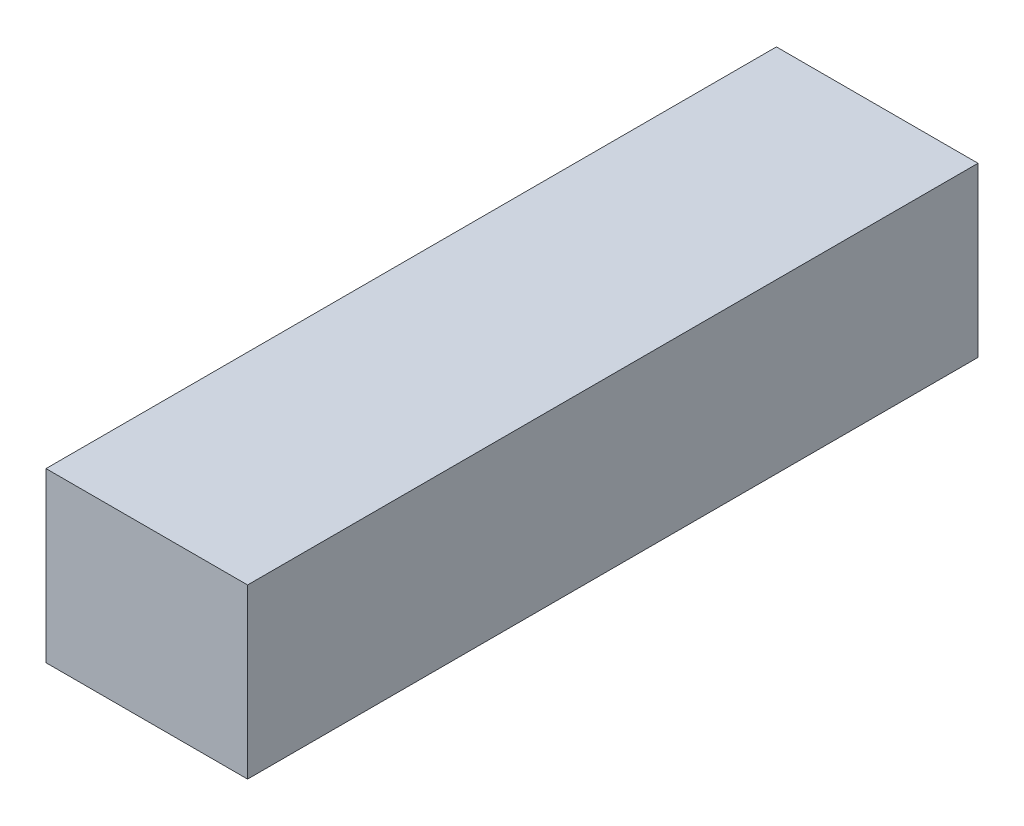
ISO-10303-21;
HEADER;
FILE_DESCRIPTION(('STEP AP214'),'2;1');
FILE_NAME('part.step','',(''),(''),'','','');
FILE_SCHEMA(('AUTOMOTIVE_DESIGN { 1 0 10303 214 1 1 1 1 }'));
ENDSEC;
DATA;
#1=APPLICATION_CONTEXT('core data for automotive mechanical design processes');
#2=APPLICATION_PROTOCOL_DEFINITION('international standard','automotive_design',2000,#1);
#3=PRODUCT_CONTEXT('',#1,'mechanical');
#4=PRODUCT('Part','Part','',(#3));
#5=PRODUCT_RELATED_PRODUCT_CATEGORY('part','',(#4));
#6=PRODUCT_DEFINITION_FORMATION('','',#4);
#7=PRODUCT_DEFINITION_CONTEXT('part definition',#1,'design');
#8=PRODUCT_DEFINITION('design','',#6,#7);
#9=PRODUCT_DEFINITION_SHAPE('','',#8);
#10=(LENGTH_UNIT() NAMED_UNIT(*) SI_UNIT(.MILLI.,.METRE.));
#11=(NAMED_UNIT(*) PLANE_ANGLE_UNIT() SI_UNIT($,.RADIAN.));
#12=(NAMED_UNIT(*) SI_UNIT($,.STERADIAN.) SOLID_ANGLE_UNIT());
#13=UNCERTAINTY_MEASURE_WITH_UNIT(LENGTH_MEASURE(1.E-05),#10,'distance_accuracy_value','');
#14=(GEOMETRIC_REPRESENTATION_CONTEXT(3) GLOBAL_UNCERTAINTY_ASSIGNED_CONTEXT((#13)) GLOBAL_UNIT_ASSIGNED_CONTEXT((#10,
#11,#12)) REPRESENTATION_CONTEXT('',''));
#15=CARTESIAN_POINT('',(0.,0.,0.));
#16=DIRECTION('',(0.,0.,1.));
#17=DIRECTION('',(1.,0.,0.));
#18=AXIS2_PLACEMENT_3D('',#15,#16,#17);
#19=CARTESIAN_POINT('',(15.225,25.4,55.165));
#20=DIRECTION('',(-1.,0.,0.));
#21=DIRECTION('',(0.,0.,1.));
#22=AXIS2_PLACEMENT_3D('',#19,#20,#21);
#23=PLANE('',#22);
#24=DIRECTION('',(0.,0.,-1.));
#25=VECTOR('',#24,1.);
#26=CARTESIAN_POINT('',(15.225,0.,55.165));
#27=LINE('',#26,#25);
#28=CARTESIAN_POINT('',(15.225,0.,55.165));
#29=VERTEX_POINT('',#28);
#30=CARTESIAN_POINT('',(15.225,0.,-55.165));
#31=VERTEX_POINT('',#30);
#32=EDGE_CURVE('E106',#29,#31,#27,.T.);
#33=ORIENTED_EDGE('',*,*,#32,.T.);
#34=DIRECTION('',(0.,-1.,0.));
#35=VECTOR('',#34,1.);
#36=CARTESIAN_POINT('',(15.225,25.4,-55.165));
#37=LINE('',#36,#35);
#38=CARTESIAN_POINT('',(15.225,25.4,-55.165));
#39=VERTEX_POINT('',#38);
#40=EDGE_CURVE('E11',#39,#31,#37,.T.);
#41=ORIENTED_EDGE('',*,*,#40,.F.);
#42=DIRECTION('',(0.,0.,-1.));
#43=VECTOR('',#42,1.);
#44=CARTESIAN_POINT('',(15.225,25.4,55.165));
#45=LINE('',#44,#43);
#46=CARTESIAN_POINT('',(15.225,25.4,55.165));
#47=VERTEX_POINT('',#46);
#48=EDGE_CURVE('E94',#47,#39,#45,.T.);
#49=ORIENTED_EDGE('',*,*,#48,.F.);
#50=DIRECTION('',(0.,-1.,0.));
#51=VECTOR('',#50,1.);
#52=CARTESIAN_POINT('',(15.225,25.4,55.165));
#53=LINE('',#52,#51);
#54=EDGE_CURVE('E102',#47,#29,#53,.T.);
#55=ORIENTED_EDGE('',*,*,#54,.T.);
#56=EDGE_LOOP('',(#33,#41,#49,#55));
#57=FACE_BOUND('',#56,.T.);
#58=ADVANCED_FACE('F43',(#57),#23,.F.);
#59=CARTESIAN_POINT('',(-15.225,25.4,-55.165));
#60=DIRECTION('',(0.,0.,1.));
#61=DIRECTION('',(1.,0.,0.));
#62=AXIS2_PLACEMENT_3D('',#59,#60,#61);
#63=PLANE('',#62);
#64=DIRECTION('',(-1.,0.,0.));
#65=VECTOR('',#64,1.);
#66=CARTESIAN_POINT('',(-15.225,0.,-55.165));
#67=LINE('',#66,#65);
#68=CARTESIAN_POINT('',(-15.225,0.,-55.165));
#69=VERTEX_POINT('',#68);
#70=EDGE_CURVE('E98',#31,#69,#67,.T.);
#71=ORIENTED_EDGE('',*,*,#70,.T.);
#72=DIRECTION('',(0.,-1.,0.));
#73=VECTOR('',#72,1.);
#74=CARTESIAN_POINT('',(-15.225,25.4,-55.165));
#75=LINE('',#74,#73);
#76=CARTESIAN_POINT('',(-15.225,25.4,-55.165));
#77=VERTEX_POINT('',#76);
#78=EDGE_CURVE('E51',#77,#69,#75,.T.);
#79=ORIENTED_EDGE('',*,*,#78,.F.);
#80=DIRECTION('',(-1.,0.,0.));
#81=VECTOR('',#80,1.);
#82=CARTESIAN_POINT('',(-15.225,25.4,-55.165));
#83=LINE('',#82,#81);
#84=EDGE_CURVE('E89',#39,#77,#83,.T.);
#85=ORIENTED_EDGE('',*,*,#84,.F.);
#86=ORIENTED_EDGE('',*,*,#40,.T.);
#87=EDGE_LOOP('',(#71,#79,#85,#86));
#88=FACE_BOUND('',#87,.T.);
#89=ADVANCED_FACE('F97',(#88),#63,.F.);
#90=CARTESIAN_POINT('',(-15.225,25.4,55.165));
#91=DIRECTION('',(1.,0.,0.));
#92=DIRECTION('',(0.,0.,-1.));
#93=AXIS2_PLACEMENT_3D('',#90,#91,#92);
#94=PLANE('',#93);
#95=DIRECTION('',(0.,0.,1.));
#96=VECTOR('',#95,1.);
#97=CARTESIAN_POINT('',(-15.225,0.,55.165));
#98=LINE('',#97,#96);
#99=CARTESIAN_POINT('',(-15.225,0.,55.165));
#100=VERTEX_POINT('',#99);
#101=EDGE_CURVE('E76',#69,#100,#98,.T.);
#102=ORIENTED_EDGE('',*,*,#101,.T.);
#103=DIRECTION('',(0.,-1.,0.));
#104=VECTOR('',#103,1.);
#105=CARTESIAN_POINT('',(-15.225,25.4,55.165));
#106=LINE('',#105,#104);
#107=CARTESIAN_POINT('',(-15.225,25.4,55.165));
#108=VERTEX_POINT('',#107);
#109=EDGE_CURVE('E99',#108,#100,#106,.T.);
#110=ORIENTED_EDGE('',*,*,#109,.F.);
#111=DIRECTION('',(0.,0.,1.));
#112=VECTOR('',#111,1.);
#113=CARTESIAN_POINT('',(-15.225,25.4,55.165));
#114=LINE('',#113,#112);
#115=EDGE_CURVE('E92',#77,#108,#114,.T.);
#116=ORIENTED_EDGE('',*,*,#115,.F.);
#117=ORIENTED_EDGE('',*,*,#78,.T.);
#118=EDGE_LOOP('',(#102,#110,#116,#117));
#119=FACE_BOUND('',#118,.T.);
#120=ADVANCED_FACE('F100',(#119),#94,.F.);
#121=CARTESIAN_POINT('',(-15.225,25.4,55.165));
#122=DIRECTION('',(0.,0.,-1.));
#123=DIRECTION('',(-1.,0.,0.));
#124=AXIS2_PLACEMENT_3D('',#121,#122,#123);
#125=PLANE('',#124);
#126=DIRECTION('',(1.,0.,0.));
#127=VECTOR('',#126,1.);
#128=CARTESIAN_POINT('',(-15.225,0.,55.165));
#129=LINE('',#128,#127);
#130=EDGE_CURVE('E82',#100,#29,#129,.T.);
#131=ORIENTED_EDGE('',*,*,#130,.T.);
#132=ORIENTED_EDGE('',*,*,#54,.F.);
#133=DIRECTION('',(1.,0.,0.));
#134=VECTOR('',#133,1.);
#135=CARTESIAN_POINT('',(-15.225,25.4,55.165));
#136=LINE('',#135,#134);
#137=EDGE_CURVE('E59',#108,#47,#136,.T.);
#138=ORIENTED_EDGE('',*,*,#137,.F.);
#139=ORIENTED_EDGE('',*,*,#109,.T.);
#140=EDGE_LOOP('',(#131,#132,#138,#139));
#141=FACE_BOUND('',#140,.T.);
#142=ADVANCED_FACE('F113',(#141),#125,.F.);
#143=CARTESIAN_POINT('',(0.,25.4,0.));
#144=DIRECTION('',(0.,-1.,0.));
#145=DIRECTION('',(0.,0.,-1.));
#146=AXIS2_PLACEMENT_3D('',#143,#144,#145);
#147=PLANE('',#146);
#148=ORIENTED_EDGE('',*,*,#48,.T.);
#149=ORIENTED_EDGE('',*,*,#84,.T.);
#150=ORIENTED_EDGE('',*,*,#115,.T.);
#151=ORIENTED_EDGE('',*,*,#137,.T.);
#152=EDGE_LOOP('',(#148,#149,#150,#151));
#153=FACE_BOUND('',#152,.T.);
#154=ADVANCED_FACE('F90',(#153),#147,.F.);
#155=CARTESIAN_POINT('',(0.,0.,0.));
#156=DIRECTION('',(0.,-1.,0.));
#157=DIRECTION('',(0.,0.,-1.));
#158=AXIS2_PLACEMENT_3D('',#155,#156,#157);
#159=PLANE('',#158);
#160=ORIENTED_EDGE('',*,*,#32,.F.);
#161=ORIENTED_EDGE('',*,*,#130,.F.);
#162=ORIENTED_EDGE('',*,*,#101,.F.);
#163=ORIENTED_EDGE('',*,*,#70,.F.);
#164=EDGE_LOOP('',(#160,#161,#162,#163));
#165=FACE_BOUND('',#164,.T.);
#166=ADVANCED_FACE('F116',(#165),#159,.T.);
#167=CLOSED_SHELL('',(#58,#89,#120,#142,#154,#166));
#168=MANIFOLD_SOLID_BREP('B2',#167);
#169=ADVANCED_BREP_SHAPE_REPRESENTATION('',(#18,#168),#14);
#170=SHAPE_DEFINITION_REPRESENTATION(#9,#169);
ENDSEC;
END-ISO-10303-21;
